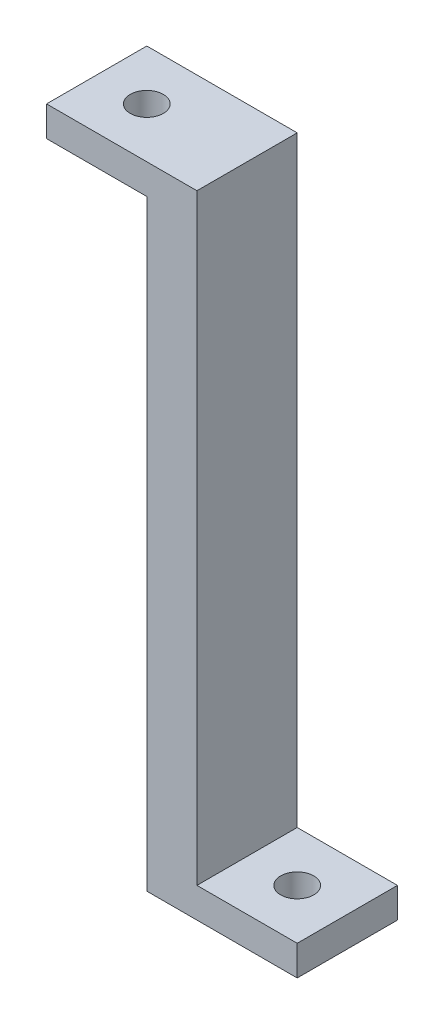
ISO-10303-21;
HEADER;
FILE_DESCRIPTION(('STEP AP214'),'2;1');
FILE_NAME('part.step','',(''),(''),'','','');
FILE_SCHEMA(('AUTOMOTIVE_DESIGN { 1 0 10303 214 1 1 1 1 }'));
ENDSEC;
DATA;
#1=APPLICATION_CONTEXT('core data for automotive mechanical design processes');
#2=APPLICATION_PROTOCOL_DEFINITION('international standard','automotive_design',2000,#1);
#3=PRODUCT_CONTEXT('',#1,'mechanical');
#4=PRODUCT('Part','Part','',(#3));
#5=PRODUCT_RELATED_PRODUCT_CATEGORY('part','',(#4));
#6=PRODUCT_DEFINITION_FORMATION('','',#4);
#7=PRODUCT_DEFINITION_CONTEXT('part definition',#1,'design');
#8=PRODUCT_DEFINITION('design','',#6,#7);
#9=PRODUCT_DEFINITION_SHAPE('','',#8);
#10=(LENGTH_UNIT() NAMED_UNIT(*) SI_UNIT(.MILLI.,.METRE.));
#11=(NAMED_UNIT(*) PLANE_ANGLE_UNIT() SI_UNIT($,.RADIAN.));
#12=(NAMED_UNIT(*) SI_UNIT($,.STERADIAN.) SOLID_ANGLE_UNIT());
#13=UNCERTAINTY_MEASURE_WITH_UNIT(LENGTH_MEASURE(1.E-05),#10,'distance_accuracy_value','');
#14=(GEOMETRIC_REPRESENTATION_CONTEXT(3) GLOBAL_UNCERTAINTY_ASSIGNED_CONTEXT((#13)) GLOBAL_UNIT_ASSIGNED_CONTEXT((#10,
#11,#12)) REPRESENTATION_CONTEXT('',''));
#15=CARTESIAN_POINT('',(0.,0.,0.));
#16=DIRECTION('',(0.,0.,1.));
#17=DIRECTION('',(1.,0.,0.));
#18=AXIS2_PLACEMENT_3D('',#15,#16,#17);
#19=CARTESIAN_POINT('',(0.,-60.,10.));
#20=DIRECTION('',(1.,0.,0.));
#21=DIRECTION('',(0.,1.,0.));
#22=AXIS2_PLACEMENT_3D('',#19,#20,#21);
#23=PLANE('',#22);
#24=DIRECTION('',(0.,-1.,0.));
#25=VECTOR('',#24,1.);
#26=CARTESIAN_POINT('',(0.,-60.,0.));
#27=LINE('',#26,#25);
#28=CARTESIAN_POINT('',(0.,0.,0.));
#29=VERTEX_POINT('',#28);
#30=CARTESIAN_POINT('',(0.,-60.,0.));
#31=VERTEX_POINT('',#30);
#32=EDGE_CURVE('E152',#29,#31,#27,.T.);
#33=ORIENTED_EDGE('',*,*,#32,.T.);
#34=DIRECTION('',(0.,0.,-1.));
#35=VECTOR('',#34,1.);
#36=CARTESIAN_POINT('',(0.,-60.,10.));
#37=LINE('',#36,#35);
#38=CARTESIAN_POINT('',(0.,-60.,10.));
#39=VERTEX_POINT('',#38);
#40=EDGE_CURVE('E11',#39,#31,#37,.T.);
#41=ORIENTED_EDGE('',*,*,#40,.F.);
#42=DIRECTION('',(0.,-1.,0.));
#43=VECTOR('',#42,1.);
#44=CARTESIAN_POINT('',(0.,-60.,10.));
#45=LINE('',#44,#43);
#46=CARTESIAN_POINT('',(0.,0.,10.));
#47=VERTEX_POINT('',#46);
#48=EDGE_CURVE('E173',#47,#39,#45,.T.);
#49=ORIENTED_EDGE('',*,*,#48,.F.);
#50=DIRECTION('',(0.,0.,-1.));
#51=VECTOR('',#50,1.);
#52=CARTESIAN_POINT('',(0.,0.,10.));
#53=LINE('',#52,#51);
#54=EDGE_CURVE('E148',#47,#29,#53,.T.);
#55=ORIENTED_EDGE('',*,*,#54,.T.);
#56=EDGE_LOOP('',(#33,#41,#49,#55));
#57=FACE_BOUND('',#56,.T.);
#58=ADVANCED_FACE('F47',(#57),#23,.F.);
#59=CARTESIAN_POINT('',(15.,-60.,10.));
#60=DIRECTION('',(0.,1.,0.));
#61=DIRECTION('',(0.,0.,1.));
#62=AXIS2_PLACEMENT_3D('',#59,#60,#61);
#63=PLANE('',#62);
#64=CARTESIAN_POINT('',(9.99999999999999,-60.,5.));
#65=DIRECTION('',(0.,1.,0.));
#66=DIRECTION('',(0.,0.,1.));
#67=AXIS2_PLACEMENT_3D('',#64,#65,#66);
#68=CIRCLE('',#67,1.65);
#69=CARTESIAN_POINT('',(9.99999999999999,-60.,6.65));
#70=VERTEX_POINT('',#69);
#71=EDGE_CURVE('E223',#70,#70,#68,.T.);
#72=ORIENTED_EDGE('',*,*,#71,.T.);
#73=EDGE_LOOP('',(#72));
#74=FACE_BOUND('',#73,.T.);
#75=DIRECTION('',(1.,0.,0.));
#76=VECTOR('',#75,1.);
#77=CARTESIAN_POINT('',(15.,-60.,0.));
#78=LINE('',#77,#76);
#79=CARTESIAN_POINT('',(15.,-60.,0.));
#80=VERTEX_POINT('',#79);
#81=EDGE_CURVE('E156',#31,#80,#78,.T.);
#82=ORIENTED_EDGE('',*,*,#81,.T.);
#83=DIRECTION('',(0.,0.,-1.));
#84=VECTOR('',#83,1.);
#85=CARTESIAN_POINT('',(15.,-60.,10.));
#86=LINE('',#85,#84);
#87=CARTESIAN_POINT('',(15.,-60.,10.));
#88=VERTEX_POINT('',#87);
#89=EDGE_CURVE('E57',#88,#80,#86,.T.);
#90=ORIENTED_EDGE('',*,*,#89,.F.);
#91=DIRECTION('',(1.,0.,0.));
#92=VECTOR('',#91,1.);
#93=CARTESIAN_POINT('',(15.,-60.,10.));
#94=LINE('',#93,#92);
#95=EDGE_CURVE('E108',#39,#88,#94,.T.);
#96=ORIENTED_EDGE('',*,*,#95,.F.);
#97=ORIENTED_EDGE('',*,*,#40,.T.);
#98=EDGE_LOOP('',(#82,#90,#96,#97));
#99=FACE_BOUND('',#98,.T.);
#100=ADVANCED_FACE('F243',(#74,#99),#63,.F.);
#101=CARTESIAN_POINT('',(15.,-57.,10.));
#102=DIRECTION('',(-1.,0.,0.));
#103=DIRECTION('',(0.,-1.,0.));
#104=AXIS2_PLACEMENT_3D('',#101,#102,#103);
#105=PLANE('',#104);
#106=DIRECTION('',(0.,1.,0.));
#107=VECTOR('',#106,1.);
#108=CARTESIAN_POINT('',(15.,-57.,0.));
#109=LINE('',#108,#107);
#110=CARTESIAN_POINT('',(15.,-57.,0.));
#111=VERTEX_POINT('',#110);
#112=EDGE_CURVE('E159',#80,#111,#109,.T.);
#113=ORIENTED_EDGE('',*,*,#112,.T.);
#114=DIRECTION('',(0.,0.,-1.));
#115=VECTOR('',#114,1.);
#116=CARTESIAN_POINT('',(15.,-57.,10.));
#117=LINE('',#116,#115);
#118=CARTESIAN_POINT('',(15.,-57.,10.));
#119=VERTEX_POINT('',#118);
#120=EDGE_CURVE('E183',#119,#111,#117,.T.);
#121=ORIENTED_EDGE('',*,*,#120,.F.);
#122=DIRECTION('',(0.,1.,0.));
#123=VECTOR('',#122,1.);
#124=CARTESIAN_POINT('',(15.,-57.,10.));
#125=LINE('',#124,#123);
#126=EDGE_CURVE('E195',#88,#119,#125,.T.);
#127=ORIENTED_EDGE('',*,*,#126,.F.);
#128=ORIENTED_EDGE('',*,*,#89,.T.);
#129=EDGE_LOOP('',(#113,#121,#127,#128));
#130=FACE_BOUND('',#129,.T.);
#131=ADVANCED_FACE('F193',(#130),#105,.F.);
#132=CARTESIAN_POINT('',(5.,-57.,10.));
#133=DIRECTION('',(0.,-1.,0.));
#134=DIRECTION('',(0.,0.,-1.));
#135=AXIS2_PLACEMENT_3D('',#132,#133,#134);
#136=PLANE('',#135);
#137=CARTESIAN_POINT('',(9.99999999999999,-57.,5.));
#138=DIRECTION('',(0.,1.,0.));
#139=DIRECTION('',(0.,0.,1.));
#140=AXIS2_PLACEMENT_3D('',#137,#138,#139);
#141=CIRCLE('',#140,1.65);
#142=CARTESIAN_POINT('',(9.99999999999999,-57.,6.65));
#143=VERTEX_POINT('',#142);
#144=EDGE_CURVE('E227',#143,#143,#141,.T.);
#145=ORIENTED_EDGE('',*,*,#144,.F.);
#146=EDGE_LOOP('',(#145));
#147=FACE_BOUND('',#146,.T.);
#148=DIRECTION('',(-1.,0.,0.));
#149=VECTOR('',#148,1.);
#150=CARTESIAN_POINT('',(5.,-57.,0.));
#151=LINE('',#150,#149);
#152=CARTESIAN_POINT('',(5.,-57.,0.));
#153=VERTEX_POINT('',#152);
#154=EDGE_CURVE('E162',#111,#153,#151,.T.);
#155=ORIENTED_EDGE('',*,*,#154,.T.);
#156=DIRECTION('',(0.,0.,-1.));
#157=VECTOR('',#156,1.);
#158=CARTESIAN_POINT('',(5.,-57.,10.));
#159=LINE('',#158,#157);
#160=CARTESIAN_POINT('',(5.,-57.,10.));
#161=VERTEX_POINT('',#160);
#162=EDGE_CURVE('E179',#161,#153,#159,.T.);
#163=ORIENTED_EDGE('',*,*,#162,.F.);
#164=DIRECTION('',(-1.,0.,0.));
#165=VECTOR('',#164,1.);
#166=CARTESIAN_POINT('',(5.,-57.,10.));
#167=LINE('',#166,#165);
#168=EDGE_CURVE('E208',#119,#161,#167,.T.);
#169=ORIENTED_EDGE('',*,*,#168,.F.);
#170=ORIENTED_EDGE('',*,*,#120,.T.);
#171=EDGE_LOOP('',(#155,#163,#169,#170));
#172=FACE_BOUND('',#171,.T.);
#173=ADVANCED_FACE('F203',(#147,#172),#136,.F.);
#174=CARTESIAN_POINT('',(4.99999999999999,3.,10.));
#175=DIRECTION('',(-1.,0.,0.));
#176=DIRECTION('',(0.,-1.,0.));
#177=AXIS2_PLACEMENT_3D('',#174,#175,#176);
#178=PLANE('',#177);
#179=DIRECTION('',(0.,1.,0.));
#180=VECTOR('',#179,1.);
#181=CARTESIAN_POINT('',(4.99999999999999,3.,0.));
#182=LINE('',#181,#180);
#183=CARTESIAN_POINT('',(4.99999999999999,3.,0.));
#184=VERTEX_POINT('',#183);
#185=EDGE_CURVE('E164',#153,#184,#182,.T.);
#186=ORIENTED_EDGE('',*,*,#185,.T.);
#187=DIRECTION('',(0.,0.,-1.));
#188=VECTOR('',#187,1.);
#189=CARTESIAN_POINT('',(4.99999999999999,3.,10.));
#190=LINE('',#189,#188);
#191=CARTESIAN_POINT('',(4.99999999999999,3.,10.));
#192=VERTEX_POINT('',#191);
#193=EDGE_CURVE('E138',#192,#184,#190,.T.);
#194=ORIENTED_EDGE('',*,*,#193,.F.);
#195=DIRECTION('',(0.,1.,0.));
#196=VECTOR('',#195,1.);
#197=CARTESIAN_POINT('',(4.99999999999999,3.,10.));
#198=LINE('',#197,#196);
#199=EDGE_CURVE('E127',#161,#192,#198,.T.);
#200=ORIENTED_EDGE('',*,*,#199,.F.);
#201=ORIENTED_EDGE('',*,*,#162,.T.);
#202=EDGE_LOOP('',(#186,#194,#200,#201));
#203=FACE_BOUND('',#202,.T.);
#204=ADVANCED_FACE('F206',(#203),#178,.F.);
#205=CARTESIAN_POINT('',(-10.,3.,10.));
#206=DIRECTION('',(0.,-1.,0.));
#207=DIRECTION('',(1.,0.,0.));
#208=AXIS2_PLACEMENT_3D('',#205,#206,#207);
#209=PLANE('',#208);
#210=CARTESIAN_POINT('',(-5.,3.,5.));
#211=DIRECTION('',(0.,1.,0.));
#212=DIRECTION('',(-1.,0.,0.));
#213=AXIS2_PLACEMENT_3D('',#210,#211,#212);
#214=CIRCLE('',#213,1.65);
#215=CARTESIAN_POINT('',(-6.65,3.,5.));
#216=VERTEX_POINT('',#215);
#217=EDGE_CURVE('E219',#216,#216,#214,.T.);
#218=ORIENTED_EDGE('',*,*,#217,.F.);
#219=EDGE_LOOP('',(#218));
#220=FACE_BOUND('',#219,.T.);
#221=DIRECTION('',(-1.,0.,0.));
#222=VECTOR('',#221,1.);
#223=CARTESIAN_POINT('',(-10.,3.,0.));
#224=LINE('',#223,#222);
#225=CARTESIAN_POINT('',(-10.,3.,0.));
#226=VERTEX_POINT('',#225);
#227=EDGE_CURVE('E136',#184,#226,#224,.T.);
#228=ORIENTED_EDGE('',*,*,#227,.T.);
#229=DIRECTION('',(0.,0.,-1.));
#230=VECTOR('',#229,1.);
#231=CARTESIAN_POINT('',(-10.,3.,10.));
#232=LINE('',#231,#230);
#233=CARTESIAN_POINT('',(-10.,3.,10.));
#234=VERTEX_POINT('',#233);
#235=EDGE_CURVE('E133',#234,#226,#232,.T.);
#236=ORIENTED_EDGE('',*,*,#235,.F.);
#237=DIRECTION('',(-1.,0.,0.));
#238=VECTOR('',#237,1.);
#239=CARTESIAN_POINT('',(-10.,3.,10.));
#240=LINE('',#239,#238);
#241=EDGE_CURVE('E121',#192,#234,#240,.T.);
#242=ORIENTED_EDGE('',*,*,#241,.F.);
#243=ORIENTED_EDGE('',*,*,#193,.T.);
#244=EDGE_LOOP('',(#228,#236,#242,#243));
#245=FACE_BOUND('',#244,.T.);
#246=ADVANCED_FACE('F134',(#220,#245),#209,.F.);
#247=CARTESIAN_POINT('',(-10.,0.,10.));
#248=DIRECTION('',(1.,0.,0.));
#249=DIRECTION('',(0.,0.,-1.));
#250=AXIS2_PLACEMENT_3D('',#247,#248,#249);
#251=PLANE('',#250);
#252=DIRECTION('',(0.,-1.,0.));
#253=VECTOR('',#252,1.);
#254=CARTESIAN_POINT('',(-10.,0.,0.));
#255=LINE('',#254,#253);
#256=CARTESIAN_POINT('',(-10.,0.,0.));
#257=VERTEX_POINT('',#256);
#258=EDGE_CURVE('E94',#226,#257,#255,.T.);
#259=ORIENTED_EDGE('',*,*,#258,.T.);
#260=DIRECTION('',(0.,0.,-1.));
#261=VECTOR('',#260,1.);
#262=CARTESIAN_POINT('',(-10.,0.,10.));
#263=LINE('',#262,#261);
#264=CARTESIAN_POINT('',(-10.,0.,10.));
#265=VERTEX_POINT('',#264);
#266=EDGE_CURVE('E139',#265,#257,#263,.T.);
#267=ORIENTED_EDGE('',*,*,#266,.F.);
#268=DIRECTION('',(0.,-1.,0.));
#269=VECTOR('',#268,1.);
#270=CARTESIAN_POINT('',(-10.,0.,10.));
#271=LINE('',#270,#269);
#272=EDGE_CURVE('E125',#234,#265,#271,.T.);
#273=ORIENTED_EDGE('',*,*,#272,.F.);
#274=ORIENTED_EDGE('',*,*,#235,.T.);
#275=EDGE_LOOP('',(#259,#267,#273,#274));
#276=FACE_BOUND('',#275,.T.);
#277=ADVANCED_FACE('F141',(#276),#251,.F.);
#278=CARTESIAN_POINT('',(0.,0.,10.));
#279=DIRECTION('',(0.,1.,0.));
#280=DIRECTION('',(-1.,0.,0.));
#281=AXIS2_PLACEMENT_3D('',#278,#279,#280);
#282=PLANE('',#281);
#283=CARTESIAN_POINT('',(-5.,0.,5.));
#284=DIRECTION('',(0.,1.,0.));
#285=DIRECTION('',(-1.,0.,0.));
#286=AXIS2_PLACEMENT_3D('',#283,#284,#285);
#287=CIRCLE('',#286,1.65);
#288=CARTESIAN_POINT('',(-6.65,0.,5.));
#289=VERTEX_POINT('',#288);
#290=EDGE_CURVE('E50',#289,#289,#287,.T.);
#291=ORIENTED_EDGE('',*,*,#290,.T.);
#292=EDGE_LOOP('',(#291));
#293=FACE_BOUND('',#292,.T.);
#294=DIRECTION('',(1.,0.,0.));
#295=VECTOR('',#294,1.);
#296=CARTESIAN_POINT('',(0.,0.,0.));
#297=LINE('',#296,#295);
#298=EDGE_CURVE('E100',#257,#29,#297,.T.);
#299=ORIENTED_EDGE('',*,*,#298,.T.);
#300=ORIENTED_EDGE('',*,*,#54,.F.);
#301=DIRECTION('',(1.,0.,0.));
#302=VECTOR('',#301,1.);
#303=CARTESIAN_POINT('',(0.,0.,10.));
#304=LINE('',#303,#302);
#305=EDGE_CURVE('E65',#265,#47,#304,.T.);
#306=ORIENTED_EDGE('',*,*,#305,.F.);
#307=ORIENTED_EDGE('',*,*,#266,.T.);
#308=EDGE_LOOP('',(#299,#300,#306,#307));
#309=FACE_BOUND('',#308,.T.);
#310=ADVANCED_FACE('F253',(#293,#309),#282,.F.);
#311=CARTESIAN_POINT('',(0.,0.,10.));
#312=DIRECTION('',(0.,0.,1.));
#313=DIRECTION('',(1.,0.,0.));
#314=AXIS2_PLACEMENT_3D('',#311,#312,#313);
#315=PLANE('',#314);
#316=ORIENTED_EDGE('',*,*,#48,.T.);
#317=ORIENTED_EDGE('',*,*,#95,.T.);
#318=ORIENTED_EDGE('',*,*,#126,.T.);
#319=ORIENTED_EDGE('',*,*,#168,.T.);
#320=ORIENTED_EDGE('',*,*,#199,.T.);
#321=ORIENTED_EDGE('',*,*,#241,.T.);
#322=ORIENTED_EDGE('',*,*,#272,.T.);
#323=ORIENTED_EDGE('',*,*,#305,.T.);
#324=EDGE_LOOP('',(#316,#317,#318,#319,#320,#321,#322,#323));
#325=FACE_BOUND('',#324,.T.);
#326=ADVANCED_FACE('F123',(#325),#315,.T.);
#327=CARTESIAN_POINT('',(0.,0.,0.));
#328=DIRECTION('',(0.,0.,1.));
#329=DIRECTION('',(1.,0.,0.));
#330=AXIS2_PLACEMENT_3D('',#327,#328,#329);
#331=PLANE('',#330);
#332=ORIENTED_EDGE('',*,*,#32,.F.);
#333=ORIENTED_EDGE('',*,*,#298,.F.);
#334=ORIENTED_EDGE('',*,*,#258,.F.);
#335=ORIENTED_EDGE('',*,*,#227,.F.);
#336=ORIENTED_EDGE('',*,*,#185,.F.);
#337=ORIENTED_EDGE('',*,*,#154,.F.);
#338=ORIENTED_EDGE('',*,*,#112,.F.);
#339=ORIENTED_EDGE('',*,*,#81,.F.);
#340=EDGE_LOOP('',(#332,#333,#334,#335,#336,#337,#338,#339));
#341=FACE_BOUND('',#340,.T.);
#342=ADVANCED_FACE('F199',(#341),#331,.F.);
#343=CARTESIAN_POINT('',(-5.,-7.,5.));
#344=DIRECTION('',(0.,1.,0.));
#345=DIRECTION('',(-1.,0.,0.));
#346=AXIS2_PLACEMENT_3D('',#343,#344,#345);
#347=CYLINDRICAL_SURFACE('',#346,1.65);
#348=ORIENTED_EDGE('',*,*,#217,.T.);
#349=EDGE_LOOP('',(#348));
#350=FACE_BOUND('',#349,.T.);
#351=ORIENTED_EDGE('',*,*,#290,.F.);
#352=EDGE_LOOP('',(#351));
#353=FACE_BOUND('',#352,.T.);
#354=ADVANCED_FACE('F272',(#350,#353),#347,.F.);
#355=CARTESIAN_POINT('',(9.99999999999999,-67.,5.));
#356=DIRECTION('',(0.,1.,0.));
#357=DIRECTION('',(0.,0.,1.));
#358=AXIS2_PLACEMENT_3D('',#355,#356,#357);
#359=CYLINDRICAL_SURFACE('',#358,1.65);
#360=ORIENTED_EDGE('',*,*,#144,.T.);
#361=EDGE_LOOP('',(#360));
#362=FACE_BOUND('',#361,.T.);
#363=ORIENTED_EDGE('',*,*,#71,.F.);
#364=EDGE_LOOP('',(#363));
#365=FACE_BOUND('',#364,.T.);
#366=ADVANCED_FACE('F233',(#362,#365),#359,.F.);
#367=CLOSED_SHELL('',(#58,#100,#131,#173,#204,#246,#277,#310,#326,#342,#354,#366));
#368=MANIFOLD_SOLID_BREP('B2',#367);
#369=ADVANCED_BREP_SHAPE_REPRESENTATION('',(#18,#368),#14);
#370=SHAPE_DEFINITION_REPRESENTATION(#9,#369);
ENDSEC;
END-ISO-10303-21;
